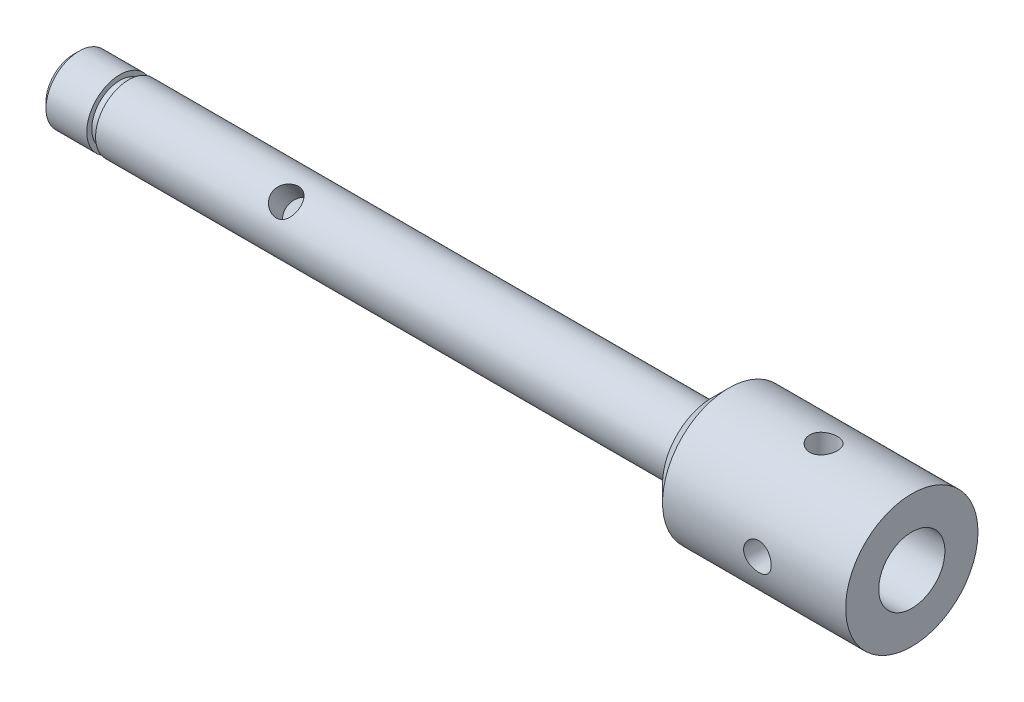
ISO-10303-21;
HEADER;
FILE_DESCRIPTION(('STEP AP214'),'2;1');
FILE_NAME('part.step','',(''),(''),'','','');
FILE_SCHEMA(('AUTOMOTIVE_DESIGN { 1 0 10303 214 1 1 1 1 }'));
ENDSEC;
DATA;
#1=APPLICATION_CONTEXT('core data for automotive mechanical design processes');
#2=APPLICATION_PROTOCOL_DEFINITION('international standard','automotive_design',2000,#1);
#3=PRODUCT_CONTEXT('',#1,'mechanical');
#4=PRODUCT('Part','Part','',(#3));
#5=PRODUCT_RELATED_PRODUCT_CATEGORY('part','',(#4));
#6=PRODUCT_DEFINITION_FORMATION('','',#4);
#7=PRODUCT_DEFINITION_CONTEXT('part definition',#1,'design');
#8=PRODUCT_DEFINITION('design','',#6,#7);
#9=PRODUCT_DEFINITION_SHAPE('','',#8);
#10=(LENGTH_UNIT() NAMED_UNIT(*) SI_UNIT(.MILLI.,.METRE.));
#11=(NAMED_UNIT(*) PLANE_ANGLE_UNIT() SI_UNIT($,.RADIAN.));
#12=(NAMED_UNIT(*) SI_UNIT($,.STERADIAN.) SOLID_ANGLE_UNIT());
#13=UNCERTAINTY_MEASURE_WITH_UNIT(LENGTH_MEASURE(1.E-05),#10,'distance_accuracy_value','');
#14=(GEOMETRIC_REPRESENTATION_CONTEXT(3) GLOBAL_UNCERTAINTY_ASSIGNED_CONTEXT((#13)) GLOBAL_UNIT_ASSIGNED_CONTEXT((#10,
#11,#12)) REPRESENTATION_CONTEXT('',''));
#15=CARTESIAN_POINT('',(0.,0.,0.));
#16=DIRECTION('',(0.,0.,1.));
#17=DIRECTION('',(1.,0.,0.));
#18=AXIS2_PLACEMENT_3D('',#15,#16,#17);
#19=CARTESIAN_POINT('',(27.2,0.,3.));
#20=DIRECTION('',(1.,0.,0.));
#21=DIRECTION('',(0.,0.,-1.));
#22=AXIS2_PLACEMENT_3D('',#19,#20,#21);
#23=PLANE('',#22);
#24=CARTESIAN_POINT('',(27.2,0.,0.));
#25=DIRECTION('',(1.,0.,0.));
#26=DIRECTION('',(0.,0.,-1.));
#27=AXIS2_PLACEMENT_3D('',#24,#25,#26);
#28=CIRCLE('',#27,4.5);
#29=CARTESIAN_POINT('',(27.2,0.,-4.5));
#30=VERTEX_POINT('',#29);
#31=EDGE_CURVE('E198',#30,#30,#28,.T.);
#32=ORIENTED_EDGE('',*,*,#31,.F.);
#33=EDGE_LOOP('',(#32));
#34=FACE_BOUND('',#33,.T.);
#35=CARTESIAN_POINT('',(27.2,0.,0.));
#36=DIRECTION('',(1.,0.,0.));
#37=DIRECTION('',(0.,0.,-1.));
#38=AXIS2_PLACEMENT_3D('',#35,#36,#37);
#39=CIRCLE('',#38,3.);
#40=CARTESIAN_POINT('',(27.2,0.,-3.));
#41=VERTEX_POINT('',#40);
#42=EDGE_CURVE('E177',#41,#41,#39,.T.);
#43=ORIENTED_EDGE('',*,*,#42,.T.);
#44=EDGE_LOOP('',(#43));
#45=FACE_BOUND('',#44,.T.);
#46=ADVANCED_FACE('F41',(#34,#45),#23,.F.);
#47=CARTESIAN_POINT('',(27.2,0.,0.));
#48=DIRECTION('',(1.,0.,0.));
#49=DIRECTION('',(0.,0.,-1.));
#50=AXIS2_PLACEMENT_3D('',#47,#48,#49);
#51=CONICAL_SURFACE('',#50,4.5,0.785398163397448);
#52=CARTESIAN_POINT('',(28.7,0.,0.));
#53=DIRECTION('',(1.,0.,0.));
#54=DIRECTION('',(0.,0.,-1.));
#55=AXIS2_PLACEMENT_3D('',#52,#53,#54);
#56=CIRCLE('',#55,6.);
#57=CARTESIAN_POINT('',(28.7,0.,-6.));
#58=VERTEX_POINT('',#57);
#59=EDGE_CURVE('E195',#58,#58,#56,.T.);
#60=ORIENTED_EDGE('',*,*,#59,.F.);
#61=EDGE_LOOP('',(#60));
#62=FACE_BOUND('',#61,.T.);
#63=ORIENTED_EDGE('',*,*,#31,.T.);
#64=EDGE_LOOP('',(#63));
#65=FACE_BOUND('',#64,.T.);
#66=ADVANCED_FACE('F125',(#62,#65),#51,.T.);
#67=CARTESIAN_POINT('',(30.7,0.,0.));
#68=DIRECTION('',(1.,0.,0.));
#69=DIRECTION('',(0.,0.,-1.));
#70=AXIS2_PLACEMENT_3D('',#67,#68,#69);
#71=CYLINDRICAL_SURFACE('',#70,6.);
#72=CARTESIAN_POINT('',(36.05,0.,6.));
#73=CARTESIAN_POINT('',(36.0500024774692,0.0694090417016604,5.99999871526651));
#74=CARTESIAN_POINT('',(36.0558006657187,0.138848789520875,5.99878328775043));
#75=CARTESIAN_POINT('',(36.0788193495328,0.275761316266992,5.9940520099068));
#76=CARTESIAN_POINT('',(36.0960485230369,0.34323256012831,5.99053441189248));
#77=CARTESIAN_POINT('',(36.1413704549218,0.474209132291339,5.98159109196202));
#78=CARTESIAN_POINT('',(36.1694523959989,0.537718336709182,5.97616727052645));
#79=CARTESIAN_POINT('',(36.2356496088562,0.659120328605955,5.96399927809859));
#80=CARTESIAN_POINT('',(36.2737644311558,0.717013367534324,5.95725516625975));
#81=CARTESIAN_POINT('',(36.3595363401906,0.826390324308832,5.9430770002465));
#82=CARTESIAN_POINT('',(36.4073120012351,0.877780244162678,5.93563505848532));
#83=CARTESIAN_POINT('',(36.5107946591951,0.971877776769385,5.92095657692448));
#84=CARTESIAN_POINT('',(36.5665023118723,1.01458467096098,5.91372005416683));
#85=CARTESIAN_POINT('',(36.6849519687661,1.09051031677216,5.90019442595308));
#86=CARTESIAN_POINT('',(36.7477583845027,1.1236305468065,5.89391545174828));
#87=CARTESIAN_POINT('',(36.8781974517727,1.17881119348063,5.8831284065002));
#88=CARTESIAN_POINT('',(36.9458295824425,1.20087280167641,5.87862014467568));
#89=CARTESIAN_POINT('',(37.0829852374156,1.23300240133736,5.87196500986123));
#90=CARTESIAN_POINT('',(37.1524683593348,1.24323597696798,5.86978556855865));
#91=CARTESIAN_POINT('',(37.2921968428626,1.25193357655614,5.86793690716491));
#92=CARTESIAN_POINT('',(37.3624421188653,1.25039890894686,5.86826740800981));
#93=CARTESIAN_POINT('',(37.5004810279752,1.23573719037197,5.87137174319175));
#94=CARTESIAN_POINT('',(37.5682959796612,1.2228010523272,5.87410533679901));
#95=CARTESIAN_POINT('',(37.7007715096449,1.18600543529945,5.88164437615942));
#96=CARTESIAN_POINT('',(37.7654319256063,1.16214539481381,5.88644992841317));
#97=CARTESIAN_POINT('',(37.890307228416,1.10400003213928,5.89763191464102));
#98=CARTESIAN_POINT('',(37.9504862965271,1.06964002534237,5.90401953785586));
#99=CARTESIAN_POINT('',(38.0642957442682,0.991522699274813,5.91763890010721));
#100=CARTESIAN_POINT('',(38.117925308836,0.94776421226258,5.92487074398537));
#101=CARTESIAN_POINT('',(38.2182139610804,0.851074921546775,5.93953730929909));
#102=CARTESIAN_POINT('',(38.264716168897,0.797981433412077,5.94697323199473));
#103=CARTESIAN_POINT('',(38.348180442229,0.684667288611796,5.96108088143001));
#104=CARTESIAN_POINT('',(38.3851423645984,0.624446525025764,5.96775259670236));
#105=CARTESIAN_POINT('',(38.4485100815359,0.498405541235478,5.97959870942815));
#106=CARTESIAN_POINT('',(38.4748968045671,0.432575461926501,5.98477039710258));
#107=CARTESIAN_POINT('',(38.5161917048355,0.297284620972158,5.99301338211281));
#108=CARTESIAN_POINT('',(38.5311013932314,0.227824338595092,5.99608495596053));
#109=CARTESIAN_POINT('',(38.5487942520679,0.0885918657008374,5.99974275215456));
#110=CARTESIAN_POINT('',(38.5517919414942,0.0188480555261806,6.00037293537579));
#111=CARTESIAN_POINT('',(38.5461550500309,-0.120143798757713,5.99919952252774));
#112=CARTESIAN_POINT('',(38.5375211813984,-0.189391872962257,5.99739607548153));
#113=CARTESIAN_POINT('',(38.5090443465305,-0.324726367119813,5.99158564979184));
#114=CARTESIAN_POINT('',(38.4893125146165,-0.390837192894206,5.98760052868077));
#115=CARTESIAN_POINT('',(38.4393221395786,-0.51881144666133,5.97787227242395));
#116=CARTESIAN_POINT('',(38.409062759134,-0.580674536336773,5.97212899744579));
#117=CARTESIAN_POINT('',(38.3384196217624,-0.69929430694349,5.95941241490714));
#118=CARTESIAN_POINT('',(38.2979080704309,-0.75597321946983,5.9524239381233));
#119=CARTESIAN_POINT('',(38.2080804369237,-0.861805445886515,5.93802568299709));
#120=CARTESIAN_POINT('',(38.1587633244811,-0.910957877913281,5.93061585542511));
#121=CARTESIAN_POINT('',(38.0517444230003,-1.0011786486518,5.91606024531377));
#122=CARTESIAN_POINT('',(37.9939169680447,-1.04209914600204,5.90892089307501));
#123=CARTESIAN_POINT('',(37.8720837157862,-1.11364719079243,5.89585601015805));
#124=CARTESIAN_POINT('',(37.8080781758609,-1.14427516677864,5.88993042894651));
#125=CARTESIAN_POINT('',(37.6760388037018,-1.19417246443922,5.88001700708041));
#126=CARTESIAN_POINT('',(37.6080289628342,-1.21350309828031,5.87601872784687));
#127=CARTESIAN_POINT('',(37.4696334495077,-1.24044038523407,5.87039184709697));
#128=CARTESIAN_POINT('',(37.3992481183805,-1.2480487154444,5.86876290660367));
#129=CARTESIAN_POINT('',(37.2595865990004,-1.25125926487611,5.86807907308506));
#130=CARTESIAN_POINT('',(37.190315929778,-1.24709542622725,5.86897402321502));
#131=CARTESIAN_POINT('',(37.0534859910798,-1.22739905314031,5.87312447254928));
#132=CARTESIAN_POINT('',(36.9859267051839,-1.21186662782266,5.87637994909626));
#133=CARTESIAN_POINT('',(36.8546022281093,-1.16998217768584,5.88486132447716));
#134=CARTESIAN_POINT('',(36.7908267535131,-1.14366117568421,5.8900815700793));
#135=CARTESIAN_POINT('',(36.6685612239733,-1.08097457299757,5.90190705738738));
#136=CARTESIAN_POINT('',(36.6100716603669,-1.04460803983029,5.9085124276546));
#137=CARTESIAN_POINT('',(36.4988783729205,-0.962073695342404,5.92251579551146));
#138=CARTESIAN_POINT('',(36.446300875435,-0.915737890418218,5.92992613868404));
#139=CARTESIAN_POINT('',(36.3495905067736,-0.814924438115327,5.94461839583213));
#140=CARTESIAN_POINT('',(36.3054595824485,-0.760444918832962,5.9519002798488));
#141=CARTESIAN_POINT('',(36.2264114268159,-0.644134427507699,5.96561444547638));
#142=CARTESIAN_POINT('',(36.1916063201137,-0.582225921521344,5.97203596073244));
#143=CARTESIAN_POINT('',(36.13294977157,-0.453319843998451,5.98319908494092));
#144=CARTESIAN_POINT('',(36.1090887528181,-0.386326781907241,5.98794216182101));
#145=CARTESIAN_POINT('',(36.0774597217116,-0.266015292900103,5.99432499781444));
#146=CARTESIAN_POINT('',(36.0671812367911,-0.213367593727927,5.99644035661395));
#147=CARTESIAN_POINT('',(36.0534505457227,-0.107152674176536,5.99927832789758));
#148=CARTESIAN_POINT('',(36.0499980873328,-0.0535854878488714,6.00000099184586));
#149=CARTESIAN_POINT('',(36.05,0.,6.));
#150=B_SPLINE_CURVE_WITH_KNOTS('',3,(#72,#73,#74,#75,#76,#77,#78,#79,#80,#81,#82,#83,#84,#85,
#86,#87,#88,#89,#90,#91,#92,#93,#94,#95,#96,#97,#98,#99,#100,#101,#102,#103,#104,#105,#106,#107,
#108,#109,#110,#111,#112,#113,#114,#115,#116,#117,#118,#119,#120,#121,#122,#123,#124,#125,#126,
#127,#128,#129,#130,#131,#132,#133,#134,#135,#136,#137,#138,#139,#140,#141,#142,#143,#144,#145,
#146,#147,#148,#149),.UNSPECIFIED.,.T.,.F.,(4,2,2,2,2,2,2,2,2,2,2,2,2,2,2,2,2,2,2,2,2,2,2,2,2,2,
2,2,2,2,2,2,2,2,2,2,2,2,4),(0.,0.208031045103183,0.416220199906223,0.624202378825437,
0.832175241572985,1.04287526388122,1.25359271551785,1.46640449178547,1.67919333285489,
1.88896575169853,2.09871484767164,2.30501712129058,2.51133000030278,2.71914592416748,
2.92698768368034,3.13889526355465,3.35080602278216,3.56309724499661,3.77536051045769,
3.98378339407674,4.19219351552276,4.3985528663262,4.60492863390931,4.81401583995734,
5.02312752564572,5.23571263829335,5.44828889851307,5.65970050095023,5.87108185414182,
6.07829223291035,6.28550062281359,6.49211731393253,6.69875319081478,6.90919024830307,
7.11967575117367,7.33258864398254,7.54531486464971,7.70592588477277,7.86653096973388),.UNSPECIFIED.);
#151=CARTESIAN_POINT('',(36.05,0.,6.));
#152=VERTEX_POINT('',#151);
#153=EDGE_CURVE('E87',#152,#152,#150,.T.);
#154=ORIENTED_EDGE('',*,*,#153,.T.);
#155=EDGE_LOOP('',(#154));
#156=FACE_BOUND('',#155,.T.);
#157=CARTESIAN_POINT('',(37.3,5.86834729715275,1.24999999999999));
#158=CARTESIAN_POINT('',(37.230609384849,5.86834869213646,1.24999750877598));
#159=CARTESIAN_POINT('',(37.1611880279848,5.86959145924544,1.24420229433947));
#160=CARTESIAN_POINT('',(37.0243136826827,5.87442015581798,1.22119649233778));
#161=CARTESIAN_POINT('',(36.9568622444936,5.87800788138388,1.20397715440341));
#162=CARTESIAN_POINT('',(36.8259276271651,5.88710292961931,1.15868397507229));
#163=CARTESIAN_POINT('',(36.7624404040082,5.89260825706946,1.13062141248931));
#164=CARTESIAN_POINT('',(36.6410755003544,5.90491581335742,1.06446988601731));
#165=CARTESIAN_POINT('',(36.58319759327,5.91171798977623,1.02638132735818));
#166=CARTESIAN_POINT('',(36.4738046248465,5.92596934661468,0.940636399466071));
#167=CARTESIAN_POINT('',(36.4223881063735,5.93342614373039,0.892855554869657));
#168=CARTESIAN_POINT('',(36.3282389313519,5.94807966802576,0.789351223880625));
#169=CARTESIAN_POINT('',(36.2855069117086,5.95527637609915,0.733627155455992));
#170=CARTESIAN_POINT('',(36.2095541119171,5.96868135118849,0.615162052999578));
#171=CARTESIAN_POINT('',(36.1764274735367,5.97487958631243,0.552359428204931));
#172=CARTESIAN_POINT('',(36.1212339471402,5.98550347343303,0.42192855100671));
#173=CARTESIAN_POINT('',(36.0991659348465,5.98992930561223,0.354300789950583));
#174=CARTESIAN_POINT('',(36.0670242388825,5.99645589892179,0.217162904200495));
#175=CARTESIAN_POINT('',(36.0567839828048,5.99858891959926,0.147693380916351));
#176=CARTESIAN_POINT('',(36.048068304243,6.00040112580612,0.00799184883951788));
#177=CARTESIAN_POINT('',(36.0495916558069,6.0000805670369,-0.0622400797368444));
#178=CARTESIAN_POINT('',(36.0642346009567,5.99704658090511,-0.200326586199577));
#179=CARTESIAN_POINT('',(36.0771747189581,5.99437018956584,-0.268201128726479));
#180=CARTESIAN_POINT('',(36.1139986253313,5.98696720898885,-0.400793746289756));
#181=CARTESIAN_POINT('',(36.1378828772031,5.98224053291904,-0.465511687511025));
#182=CARTESIAN_POINT('',(36.1960800521255,5.97120767323924,-0.590460005384686));
#183=CARTESIAN_POINT('',(36.2304622942097,5.96489104125346,-0.650657134981651));
#184=CARTESIAN_POINT('',(36.3086280028404,5.95137300440189,-0.764493456510647));
#185=CARTESIAN_POINT('',(36.3524126382061,5.94417148958325,-0.818131831816417));
#186=CARTESIAN_POINT('',(36.4491216248911,5.92951700233276,-0.91839420327691));
#187=CARTESIAN_POINT('',(36.5022030599819,5.92206184975926,-0.964866487494793));
#188=CARTESIAN_POINT('',(36.6154820489948,5.90786872648996,-1.04827597240488));
#189=CARTESIAN_POINT('',(36.6756797613872,5.9011307717716,-1.0852129606998));
#190=CARTESIAN_POINT('',(36.8017122548288,5.88912998409156,-1.14856217138454));
#191=CARTESIAN_POINT('',(36.8675606506934,5.88387085232125,-1.17494805489727));
#192=CARTESIAN_POINT('',(37.0028916193694,5.8754760641036,-1.21623577538672));
#193=CARTESIAN_POINT('',(37.0723736728081,5.87234010507182,-1.23113924882348));
#194=CARTESIAN_POINT('',(37.2116197063189,5.86860783239132,-1.24880863867017));
#195=CARTESIAN_POINT('',(37.281354584537,5.86796551863474,-1.25179442917998));
#196=CARTESIAN_POINT('',(37.4203258115401,5.86916952018704,-1.24613693439294));
#197=CARTESIAN_POINT('',(37.4895621909023,5.87101568152624,-1.23749436857862));
#198=CARTESIAN_POINT('',(37.6248205160581,5.87694538226167,-1.20901558325483));
#199=CARTESIAN_POINT('',(37.6908686671788,5.88100511282998,-1.18929841376871));
#200=CARTESIAN_POINT('',(37.8187239894416,5.8908833850312,-1.13935810860918));
#201=CARTESIAN_POINT('',(37.8805307856504,5.89670208191057,-1.10913404556146));
#202=CARTESIAN_POINT('',(37.9991064412162,5.90954501937191,-1.03854598181484));
#203=CARTESIAN_POINT('',(38.0557922044662,5.91658506648324,-0.998045327353955));
#204=CARTESIAN_POINT('',(38.1616432491551,5.93103483993908,-0.908234440569873));
#205=CARTESIAN_POINT('',(38.2108076862392,5.93844460766532,-0.858923220505168));
#206=CARTESIAN_POINT('',(38.3010627130972,5.95294924316737,-0.751900450843335));
#207=CARTESIAN_POINT('',(38.3420040950264,5.9600367471991,-0.694061907614547));
#208=CARTESIAN_POINT('',(38.413588752088,5.97296708772407,-0.572200102216356));
#209=CARTESIAN_POINT('',(38.4442324822374,5.97880997920818,-0.508177113476878));
#210=CARTESIAN_POINT('',(38.4941386793173,5.98856148270679,-0.376142117847916));
#211=CARTESIAN_POINT('',(38.5134691655443,5.99248163136497,-0.308156710970192));
#212=CARTESIAN_POINT('',(38.5404144040081,5.99799561410226,-0.16981340050347));
#213=CARTESIAN_POINT('',(38.5480306935327,5.99958975342889,-0.0994558094616936));
#214=CARTESIAN_POINT('',(38.5512676220485,6.00026408056941,0.0402133434703402));
#215=CARTESIAN_POINT('',(38.5471118999947,5.99939113754811,0.109519592177923));
#216=CARTESIAN_POINT('',(38.5274193613471,5.99532874094472,0.246422870373552));
#217=CARTESIAN_POINT('',(38.5118827135932,5.99213932172839,0.314019925202701));
#218=CARTESIAN_POINT('',(38.4699722053514,5.98380460077544,0.44543196549205));
#219=CARTESIAN_POINT('',(38.4436273361469,5.97866453407556,0.509256550004522));
#220=CARTESIAN_POINT('',(38.380877602268,5.96697995347704,0.631610567220739));
#221=CARTESIAN_POINT('',(38.3444718616568,5.96043531730246,0.690139538279507));
#222=CARTESIAN_POINT('',(38.2618903320067,5.94651596786387,0.801340321298254));
#223=CARTESIAN_POINT('',(38.2155557119433,5.93912880302851,0.853892633615918));
#224=CARTESIAN_POINT('',(38.1147554990029,5.9244278681135,0.950552741980376));
#225=CARTESIAN_POINT('',(38.0602879700516,5.91711411595368,0.994658521571224));
#226=CARTESIAN_POINT('',(37.9439908975666,5.90329191643327,1.07367451852766));
#227=CARTESIAN_POINT('',(37.8820815885379,5.89679406702551,1.10846928126993));
#228=CARTESIAN_POINT('',(37.7531748439167,5.88547039658063,1.16710627925305));
#229=CARTESIAN_POINT('',(37.686181951547,5.88064310352601,1.19095816292459));
#230=CARTESIAN_POINT('',(37.5658937184316,5.87414004405196,1.2225655413186));
#231=CARTESIAN_POINT('',(37.5132704634069,5.87198163591589,1.23283449005669));
#232=CARTESIAN_POINT('',(37.407104219479,5.86908475266778,1.24655254358403));
#233=CARTESIAN_POINT('',(37.3535612676899,5.86834622039194,1.2500019229274));
#234=CARTESIAN_POINT('',(37.3,5.86834729715275,1.24999999999999));
#235=B_SPLINE_CURVE_WITH_KNOTS('',3,(#157,#158,#159,#160,#161,#162,#163,#164,#165,#166,#167,
#168,#169,#170,#171,#172,#173,#174,#175,#176,#177,#178,#179,#180,#181,#182,#183,#184,#185,#186,
#187,#188,#189,#190,#191,#192,#193,#194,#195,#196,#197,#198,#199,#200,#201,#202,#203,#204,#205,
#206,#207,#208,#209,#210,#211,#212,#213,#214,#215,#216,#217,#218,#219,#220,#221,#222,#223,#224,
#225,#226,#227,#228,#229,#230,#231,#232,#233,#234),.UNSPECIFIED.,.T.,.F.,(4,2,2,2,2,2,2,2,2,2,2,
2,2,2,2,2,2,2,2,2,2,2,2,2,2,2,2,2,2,2,2,2,2,2,2,2,2,2,4),(0.,0.207975654071263,0.41611079241747,
0.624030014802732,0.831940834815789,1.04271333467885,1.25350128663873,1.46629026266843,
1.67905760106932,1.88879048859263,2.09850151896338,2.3049734141646,2.51145405455869,
2.71932871977948,2.92722924104258,3.13905862244911,3.35089272191626,3.56325237332486,
3.77558175387594,3.98397516009789,4.19235567296522,4.3985378623192,4.60473825464028,
4.81383917934648,5.02296356082183,5.2355945875334,5.44821621759037,5.65954599648531,
5.87084803959578,6.07816293922641,6.28547476332978,6.49223410585097,6.6990114552817,
6.90938318978569,7.1198050842753,7.33272651358118,7.54545984571983,7.70599867585765,
7.86653104261156),.UNSPECIFIED.);
#236=CARTESIAN_POINT('',(37.3,5.86834729715275,1.24999999999999));
#237=VERTEX_POINT('',#236);
#238=EDGE_CURVE('E55',#237,#237,#235,.T.);
#239=ORIENTED_EDGE('',*,*,#238,.T.);
#240=EDGE_LOOP('',(#239));
#241=FACE_BOUND('',#240,.T.);
#242=CARTESIAN_POINT('',(45.3,0.,0.));
#243=DIRECTION('',(1.,0.,0.));
#244=DIRECTION('',(0.,0.,-1.));
#245=AXIS2_PLACEMENT_3D('',#242,#243,#244);
#246=CIRCLE('',#245,6.);
#247=CARTESIAN_POINT('',(45.3,0.,-6.));
#248=VERTEX_POINT('',#247);
#249=EDGE_CURVE('E192',#248,#248,#246,.T.);
#250=ORIENTED_EDGE('',*,*,#249,.F.);
#251=EDGE_LOOP('',(#250));
#252=FACE_BOUND('',#251,.T.);
#253=ORIENTED_EDGE('',*,*,#59,.T.);
#254=EDGE_LOOP('',(#253));
#255=FACE_BOUND('',#254,.T.);
#256=ADVANCED_FACE('F130',(#156,#241,#252,#255),#71,.T.);
#257=CARTESIAN_POINT('',(45.3,0.,3.));
#258=DIRECTION('',(-1.,0.,0.));
#259=DIRECTION('',(0.,0.,1.));
#260=AXIS2_PLACEMENT_3D('',#257,#258,#259);
#261=PLANE('',#260);
#262=CARTESIAN_POINT('',(45.3,0.,0.));
#263=DIRECTION('',(1.,0.,0.));
#264=DIRECTION('',(0.,0.,-1.));
#265=AXIS2_PLACEMENT_3D('',#262,#263,#264);
#266=CIRCLE('',#265,3.);
#267=CARTESIAN_POINT('',(45.3,0.,-3.));
#268=VERTEX_POINT('',#267);
#269=EDGE_CURVE('E70',#268,#268,#266,.T.);
#270=ORIENTED_EDGE('',*,*,#269,.F.);
#271=EDGE_LOOP('',(#270));
#272=FACE_BOUND('',#271,.T.);
#273=ORIENTED_EDGE('',*,*,#249,.T.);
#274=EDGE_LOOP('',(#273));
#275=FACE_BOUND('',#274,.T.);
#276=ADVANCED_FACE('F138',(#272,#275),#261,.F.);
#277=CARTESIAN_POINT('',(-30.7,0.,3.));
#278=DIRECTION('',(1.,0.,0.));
#279=DIRECTION('',(0.,0.,-1.));
#280=AXIS2_PLACEMENT_3D('',#277,#278,#279);
#281=PLANE('',#280);
#282=CARTESIAN_POINT('',(-30.7,0.,0.));
#283=DIRECTION('',(1.,0.,0.));
#284=DIRECTION('',(0.,0.,-1.));
#285=AXIS2_PLACEMENT_3D('',#282,#283,#284);
#286=CIRCLE('',#285,2.49999999999998);
#287=CARTESIAN_POINT('',(-30.7,0.,-2.49999999999998));
#288=VERTEX_POINT('',#287);
#289=EDGE_CURVE('E203',#288,#288,#286,.F.);
#290=ORIENTED_EDGE('',*,*,#289,.T.);
#291=EDGE_LOOP('',(#290));
#292=FACE_BOUND('',#291,.T.);
#293=ADVANCED_FACE('F142',(#292),#281,.F.);
#294=CARTESIAN_POINT('',(30.7,0.,0.));
#295=DIRECTION('',(1.,0.,0.));
#296=DIRECTION('',(0.,0.,-1.));
#297=AXIS2_PLACEMENT_3D('',#294,#295,#296);
#298=CYLINDRICAL_SURFACE('',#297,3.);
#299=CARTESIAN_POINT('',(-30.2,0.,0.));
#300=DIRECTION('',(1.,0.,0.));
#301=DIRECTION('',(0.,0.,-1.));
#302=AXIS2_PLACEMENT_3D('',#299,#300,#301);
#303=CIRCLE('',#302,3.);
#304=CARTESIAN_POINT('',(-30.2,0.,-3.));
#305=VERTEX_POINT('',#304);
#306=EDGE_CURVE('E201',#305,#305,#303,.T.);
#307=ORIENTED_EDGE('',*,*,#306,.T.);
#308=EDGE_LOOP('',(#307));
#309=FACE_BOUND('',#308,.T.);
#310=CARTESIAN_POINT('',(-26.5,0.,0.));
#311=DIRECTION('',(1.,0.,0.));
#312=DIRECTION('',(0.,0.,-1.));
#313=AXIS2_PLACEMENT_3D('',#310,#311,#312);
#314=CIRCLE('',#313,3.);
#315=CARTESIAN_POINT('',(-26.5,0.,-3.));
#316=VERTEX_POINT('',#315);
#317=EDGE_CURVE('E189',#316,#316,#314,.T.);
#318=ORIENTED_EDGE('',*,*,#317,.F.);
#319=EDGE_LOOP('',(#318));
#320=FACE_BOUND('',#319,.T.);
#321=ADVANCED_FACE('F146',(#309,#320),#298,.T.);
#322=CARTESIAN_POINT('',(-26.5,0.,2.54999999999999));
#323=DIRECTION('',(-1.,0.,0.));
#324=DIRECTION('',(0.,0.,1.));
#325=AXIS2_PLACEMENT_3D('',#322,#323,#324);
#326=PLANE('',#325);
#327=CARTESIAN_POINT('',(-26.5,0.,0.));
#328=DIRECTION('',(1.,0.,0.));
#329=DIRECTION('',(0.,0.,-1.));
#330=AXIS2_PLACEMENT_3D('',#327,#328,#329);
#331=CIRCLE('',#330,2.54999999999999);
#332=CARTESIAN_POINT('',(-26.5,0.,-2.54999999999999));
#333=VERTEX_POINT('',#332);
#334=EDGE_CURVE('E184',#333,#333,#331,.T.);
#335=ORIENTED_EDGE('',*,*,#334,.F.);
#336=EDGE_LOOP('',(#335));
#337=FACE_BOUND('',#336,.T.);
#338=ORIENTED_EDGE('',*,*,#317,.T.);
#339=EDGE_LOOP('',(#338));
#340=FACE_BOUND('',#339,.T.);
#341=ADVANCED_FACE('F150',(#337,#340),#326,.F.);
#342=CARTESIAN_POINT('',(30.7,0.,0.));
#343=DIRECTION('',(1.,0.,0.));
#344=DIRECTION('',(0.,0.,-1.));
#345=AXIS2_PLACEMENT_3D('',#342,#343,#344);
#346=CYLINDRICAL_SURFACE('',#345,2.54999999999999);
#347=CARTESIAN_POINT('',(-25.7,0.,0.));
#348=DIRECTION('',(1.,0.,0.));
#349=DIRECTION('',(0.,0.,-1.));
#350=AXIS2_PLACEMENT_3D('',#347,#348,#349);
#351=CIRCLE('',#350,2.54999999999999);
#352=CARTESIAN_POINT('',(-25.7,0.,-2.54999999999999));
#353=VERTEX_POINT('',#352);
#354=EDGE_CURVE('E181',#353,#353,#351,.T.);
#355=ORIENTED_EDGE('',*,*,#354,.F.);
#356=EDGE_LOOP('',(#355));
#357=FACE_BOUND('',#356,.T.);
#358=ORIENTED_EDGE('',*,*,#334,.T.);
#359=EDGE_LOOP('',(#358));
#360=FACE_BOUND('',#359,.T.);
#361=ADVANCED_FACE('F154',(#357,#360),#346,.T.);
#362=CARTESIAN_POINT('',(-25.7,0.,3.));
#363=DIRECTION('',(1.,0.,0.));
#364=DIRECTION('',(0.,0.,-1.));
#365=AXIS2_PLACEMENT_3D('',#362,#363,#364);
#366=PLANE('',#365);
#367=CARTESIAN_POINT('',(-25.7,0.,0.));
#368=DIRECTION('',(1.,0.,0.));
#369=DIRECTION('',(0.,0.,-1.));
#370=AXIS2_PLACEMENT_3D('',#367,#368,#369);
#371=CIRCLE('',#370,3.);
#372=CARTESIAN_POINT('',(-25.7,0.,-3.));
#373=VERTEX_POINT('',#372);
#374=EDGE_CURVE('E180',#373,#373,#371,.T.);
#375=ORIENTED_EDGE('',*,*,#374,.F.);
#376=EDGE_LOOP('',(#375));
#377=FACE_BOUND('',#376,.T.);
#378=ORIENTED_EDGE('',*,*,#354,.T.);
#379=EDGE_LOOP('',(#378));
#380=FACE_BOUND('',#379,.T.);
#381=ADVANCED_FACE('F158',(#377,#380),#366,.F.);
#382=CARTESIAN_POINT('',(30.7,0.,0.));
#383=DIRECTION('',(1.,0.,0.));
#384=DIRECTION('',(0.,0.,-1.));
#385=AXIS2_PLACEMENT_3D('',#382,#383,#384);
#386=CYLINDRICAL_SURFACE('',#385,3.);
#387=CARTESIAN_POINT('',(-9.69999999999999,1.45725163441085,2.62229244631618));
#388=CARTESIAN_POINT('',(-9.76667189089685,1.45726179732362,2.62229072035417));
#389=CARTESIAN_POINT('',(-9.83345265682621,1.46242939631793,2.61943604998584));
#390=CARTESIAN_POINT('',(-9.96508694205714,1.48272432827545,2.60799826208618));
#391=CARTESIAN_POINT('',(-10.0299347266752,1.49787870698695,2.59939958803531));
#392=CARTESIAN_POINT('',(-10.1555611296911,1.53694402846531,2.57649173670678));
#393=CARTESIAN_POINT('',(-10.216355163715,1.56081926066065,2.56220582665124));
#394=CARTESIAN_POINT('',(-10.332759449578,1.61583000686717,2.52787270306059));
#395=CARTESIAN_POINT('',(-10.3883709234331,1.64696380325954,2.50782685225945));
#396=CARTESIAN_POINT('',(-10.4963257249735,1.71681425383968,2.46057350785954));
#397=CARTESIAN_POINT('',(-10.5483075587441,1.75585966211184,2.43302572268617));
#398=CARTESIAN_POINT('',(-10.6442002224975,1.83839325759243,2.37127921641488));
#399=CARTESIAN_POINT('',(-10.688107940613,1.88188314775642,2.33707794138432));
#400=CARTESIAN_POINT('',(-10.7684495308793,1.97336905117507,2.2604253378426));
#401=CARTESIAN_POINT('',(-10.8044766280323,2.0214786953555,2.21768051420216));
#402=CARTESIAN_POINT('',(-10.8652760205056,2.11829251863121,2.12539377774707));
#403=CARTESIAN_POINT('',(-10.8900533119642,2.16699642392196,2.07585489498695));
#404=CARTESIAN_POINT('',(-10.9263394587567,2.26033348536551,1.97368378940636));
#405=CARTESIAN_POINT('',(-10.938471694902,2.30504658597604,1.92134669736412));
#406=CARTESIAN_POINT('',(-10.9511376411598,2.39132714775115,1.81282975254559));
#407=CARTESIAN_POINT('',(-10.951676055883,2.43289587803344,1.75665146775554));
#408=CARTESIAN_POINT('',(-10.9414657190667,2.50912152525229,1.64577132233137));
#409=CARTESIAN_POINT('',(-10.9314018994743,2.54404512531086,1.59118768236724));
#410=CARTESIAN_POINT('',(-10.9014468973618,2.60920185851382,1.48192889927436));
#411=CARTESIAN_POINT('',(-10.8815549903698,2.63943464566163,1.42725374969618));
#412=CARTESIAN_POINT('',(-10.8322719591054,2.69534195753457,1.3186813478563));
#413=CARTESIAN_POINT('',(-10.8027405371292,2.72093990030251,1.26480869062801));
#414=CARTESIAN_POINT('',(-10.7351542432997,2.76710037597535,1.16035396981371));
#415=CARTESIAN_POINT('',(-10.697096359155,2.78766112391544,1.1097730773364));
#416=CARTESIAN_POINT('',(-10.6104175795954,2.82539032249079,1.01005397939162));
#417=CARTESIAN_POINT('',(-10.561241208721,2.84221749629643,0.96126878465629));
#418=CARTESIAN_POINT('',(-10.4552885592934,2.87114767708475,0.871068084242581));
#419=CARTESIAN_POINT('',(-10.3985093617079,2.88324886254533,0.829655423475404));
#420=CARTESIAN_POINT('',(-10.2766049633381,2.90375383075197,0.754832407587505));
#421=CARTESIAN_POINT('',(-10.2112667942567,2.91202302330776,0.721729789043686));
#422=CARTESIAN_POINT('',(-10.0755189550255,2.92496933660976,0.667341912857268));
#423=CARTESIAN_POINT('',(-10.0051129517304,2.92964902654014,0.646048206023237));
#424=CARTESIAN_POINT('',(-9.86610319108599,2.93574126800468,0.61775453829243));
#425=CARTESIAN_POINT('',(-9.79767887774094,2.9373460947829,0.60991682426925));
#426=CARTESIAN_POINT('',(-9.66052151758849,2.93805823255438,0.606481132240161));
#427=CARTESIAN_POINT('',(-9.59178858580828,2.9371664075936,0.610878919745442));
#428=CARTESIAN_POINT('',(-9.46060161456955,2.93292479530176,0.630906375529169));
#429=CARTESIAN_POINT('',(-9.39802731321319,2.92973602877029,0.645798922790256));
#430=CARTESIAN_POINT('',(-9.27614870350212,2.92079159681015,0.685112984692685));
#431=CARTESIAN_POINT('',(-9.21684516316928,2.9150353313549,0.709536726614914));
#432=CARTESIAN_POINT('',(-9.10038468964352,2.90021795197029,0.767903787274199));
#433=CARTESIAN_POINT('',(-9.04342502538967,2.8910272025277,0.80220645336879));
#434=CARTESIAN_POINT('',(-8.93559194750097,2.86881677078566,0.878328402415585));
#435=CARTESIAN_POINT('',(-8.88472118329813,2.85579543016024,0.920150937787844));
#436=CARTESIAN_POINT('',(-8.78619986511599,2.82410065815671,1.01344534174048));
#437=CARTESIAN_POINT('',(-8.73914860004933,2.80505339594761,1.06542557534014));
#438=CARTESIAN_POINT('',(-8.65452770802067,2.76118183980697,1.17444613968791));
#439=CARTESIAN_POINT('',(-8.61695877593629,2.73635712275211,1.23148684085992));
#440=CARTESIAN_POINT('',(-8.55241012455642,2.68051781346865,1.34871972541417));
#441=CARTESIAN_POINT('',(-8.52545775871051,2.64948753849579,1.40891960246476));
#442=CARTESIAN_POINT('',(-8.48338320766556,2.58142622042511,1.53004981931957));
#443=CARTESIAN_POINT('',(-8.46825398177393,2.54439876454082,1.59097970241947));
#444=CARTESIAN_POINT('',(-8.45114187447969,2.46789942893283,1.707033560141));
#445=CARTESIAN_POINT('',(-8.44831400030303,2.42877932048442,1.76226566747336));
#446=CARTESIAN_POINT('',(-8.45361314129394,2.34715284711974,1.86960326345898));
#447=CARTESIAN_POINT('',(-8.46173823601286,2.30464707706092,1.92170929855189));
#448=CARTESIAN_POINT('',(-8.48810607215866,2.2192867208128,2.01961383053855));
#449=CARTESIAN_POINT('',(-8.50597968046955,2.17649799643237,2.06557050935804));
#450=CARTESIAN_POINT('',(-8.55093424720912,2.09064122167797,2.15242935964222));
#451=CARTESIAN_POINT('',(-8.5780169546649,2.04757311976885,2.19333056893944));
#452=CARTESIAN_POINT('',(-8.64198952921446,1.96075993378061,2.27133884317379));
#453=CARTESIAN_POINT('',(-8.67926730142399,1.91707221922753,2.30819089827737));
#454=CARTESIAN_POINT('',(-8.76200718287189,1.83275576792571,2.37569531626767));
#455=CARTESIAN_POINT('',(-8.80747233040674,1.79212817473855,2.40634536862285));
#456=CARTESIAN_POINT('',(-8.9089448258544,1.7130280878751,2.46334558995301));
#457=CARTESIAN_POINT('',(-8.96545901462112,1.67489035926423,2.48926124818969));
#458=CARTESIAN_POINT('',(-9.08545874068019,1.60612577933059,2.53417712819009));
#459=CARTESIAN_POINT('',(-9.14894814805814,1.57550312840404,2.55317348541363));
#460=CARTESIAN_POINT('',(-9.28094383502274,1.52398717987208,2.58425386708882));
#461=CARTESIAN_POINT('',(-9.3494211587932,1.50304221470478,2.59637467991106));
#462=CARTESIAN_POINT('',(-9.48953957385066,1.47241331267062,2.6138714091583));
#463=CARTESIAN_POINT('',(-9.5611692072743,1.46269160795414,2.61926995181786));
#464=CARTESIAN_POINT('',(-9.65535852426188,1.45782319400708,2.62197366681803));
#465=CARTESIAN_POINT('',(-9.67767315738803,1.45724823109123,2.62229302430012));
#466=CARTESIAN_POINT('',(-9.69999999999999,1.45725163441085,2.62229244631618));
#467=B_SPLINE_CURVE_WITH_KNOTS('',3,(#387,#388,#389,#390,#391,#392,#393,#394,#395,#396,#397,
#398,#399,#400,#401,#402,#403,#404,#405,#406,#407,#408,#409,#410,#411,#412,#413,#414,#415,#416,
#417,#418,#419,#420,#421,#422,#423,#424,#425,#426,#427,#428,#429,#430,#431,#432,#433,#434,#435,
#436,#437,#438,#439,#440,#441,#442,#443,#444,#445,#446,#447,#448,#449,#450,#451,#452,#453,#454,
#455,#456,#457,#458,#459,#460,#461,#462,#463,#464,#465,#466),.UNSPECIFIED.,.T.,.F.,(4,2,2,2,2,2,
2,2,2,2,2,2,2,2,2,2,2,2,2,2,2,2,2,2,2,2,2,2,2,2,2,2,2,2,2,2,2,2,2,4),(0.,0.199951711985515,
0.400447161842176,0.600130652152111,0.7997669385501,1.01066841430654,1.22165100459911,
1.44178476577924,1.66182066774891,1.87040605977952,2.0789068091793,2.27471840245093,
2.47054443201883,2.66935814640065,2.86824221022484,3.08114531844484,3.29413040441366,
3.51411545666722,3.73394290745569,3.93950778306307,4.14500152518448,4.33733901066192,
4.5297214691353,4.73025126818169,4.93086800795465,5.14781662735513,5.36478114041866,
5.58230105955595,5.79969134643007,6.00188635094053,6.20404590801914,6.39903415036487,
6.59405944632172,6.79789862829037,7.00181361048904,7.21960426908077,7.43751638139189,
7.65425125796865,7.87025464546162,7.93721375436705),.UNSPECIFIED.);
#468=CARTESIAN_POINT('',(-9.69999999999999,1.45725163441085,2.62229244631618));
#469=VERTEX_POINT('',#468);
#470=EDGE_CURVE('E11',#469,#469,#467,.T.);
#471=ORIENTED_EDGE('',*,*,#470,.T.);
#472=EDGE_LOOP('',(#471));
#473=FACE_BOUND('',#472,.T.);
#474=ORIENTED_EDGE('',*,*,#42,.F.);
#475=EDGE_LOOP('',(#474));
#476=FACE_BOUND('',#475,.T.);
#477=ORIENTED_EDGE('',*,*,#374,.T.);
#478=EDGE_LOOP('',(#477));
#479=FACE_BOUND('',#478,.T.);
#480=ADVANCED_FACE('F161',(#473,#476,#479),#386,.T.);
#481=CARTESIAN_POINT('',(-30.2,0.,0.));
#482=DIRECTION('',(1.,0.,0.));
#483=DIRECTION('',(0.,0.,-1.));
#484=AXIS2_PLACEMENT_3D('',#481,#482,#483);
#485=CONICAL_SURFACE('',#484,3.,0.785398163397459);
#486=ORIENTED_EDGE('',*,*,#289,.F.);
#487=EDGE_LOOP('',(#486));
#488=FACE_BOUND('',#487,.T.);
#489=ORIENTED_EDGE('',*,*,#306,.F.);
#490=EDGE_LOOP('',(#489));
#491=FACE_BOUND('',#490,.T.);
#492=ADVANCED_FACE('F44',(#488,#491),#485,.T.);
#493=CARTESIAN_POINT('',(37.3,6.,0.));
#494=DIRECTION('',(0.,1.,0.));
#495=DIRECTION('',(0.,0.,1.));
#496=AXIS2_PLACEMENT_3D('',#493,#494,#495);
#497=CYLINDRICAL_SURFACE('',#496,1.24999999999999);
#498=CARTESIAN_POINT('',(37.3,2.72717802865893,1.24999999999999));
#499=CARTESIAN_POINT('',(37.2333281091031,2.7271851956322,1.24999259066566));
#500=CARTESIAN_POINT('',(37.1665473431738,2.729658595344,1.24463203881502));
#501=CARTESIAN_POINT('',(37.0349130579428,2.73923833650884,1.22339678947783));
#502=CARTESIAN_POINT('',(36.9700652733248,2.74635725824267,1.20749354003275));
#503=CARTESIAN_POINT('',(36.8444388703089,2.76426917574768,1.16589988419449));
#504=CARTESIAN_POINT('',(36.783644836285,2.77504717562616,1.14024937431427));
#505=CARTESIAN_POINT('',(36.6672405504219,2.79904148565793,1.08000637754461));
#506=CARTESIAN_POINT('',(36.6116290765669,2.81225721880783,1.0454160059153));
#507=CARTESIAN_POINT('',(36.5036742750265,2.84055762619857,0.965973882676153));
#508=CARTESIAN_POINT('',(36.4516924412559,2.85570568079146,0.920653238184397));
#509=CARTESIAN_POINT('',(36.3557997775024,2.88564295372227,0.82202167574554));
#510=CARTESIAN_POINT('',(36.311892059387,2.90043203180789,0.768707691373995));
#511=CARTESIAN_POINT('',(36.2315504691207,2.92875537930613,0.65276339379734));
#512=CARTESIAN_POINT('',(36.1955233719677,2.94220739975291,0.589829293683652));
#513=CARTESIAN_POINT('',(36.1347239794944,2.96556519993426,0.458132022362346));
#514=CARTESIAN_POINT('',(36.1099466880358,2.97547255347157,0.389371454872117));
#515=CARTESIAN_POINT('',(36.0736605412433,2.99017521042366,0.251768498025159));
#516=CARTESIAN_POINT('',(36.061528305098,2.99520971127466,0.183116576196075));
#517=CARTESIAN_POINT('',(36.0488623588401,3.00046828611204,0.0445791803650012));
#518=CARTESIAN_POINT('',(36.048323944117,3.00069431131015,-0.0253057817645209));
#519=CARTESIAN_POINT('',(36.0585342809333,2.99645129133056,-0.159792780112572));
#520=CARTESIAN_POINT('',(36.0685981005257,2.99226714648664,-0.224457488607318));
#521=CARTESIAN_POINT('',(36.0985531026382,2.98006516750308,-0.35108289393146));
#522=CARTESIAN_POINT('',(36.1184450096302,2.97204705074577,-0.413043391054919));
#523=CARTESIAN_POINT('',(36.1677280408946,2.95279852414028,-0.533638118077528));
#524=CARTESIAN_POINT('',(36.1972594628708,2.94152097126085,-0.592207177074907));
#525=CARTESIAN_POINT('',(36.2648457567003,2.91685713989805,-0.703711767281963));
#526=CARTESIAN_POINT('',(36.302903640845,2.90347011666255,-0.756645297756974));
#527=CARTESIAN_POINT('',(36.3895824204046,2.87481698777061,-0.859340911707923));
#528=CARTESIAN_POINT('',(36.438758791279,2.85948494356009,-0.908616437316239));
#529=CARTESIAN_POINT('',(36.5447114407066,2.8293786068147,-0.998431414927666));
#530=CARTESIAN_POINT('',(36.6014906382921,2.8146045313137,-1.03896749582431));
#531=CARTESIAN_POINT('',(36.7233950366619,2.78681612355338,-1.11140189250063));
#532=CARTESIAN_POINT('',(36.7887332057433,2.77387558556714,-1.1429725335554));
#533=CARTESIAN_POINT('',(36.9244810449745,2.75209844221011,-1.19446432058391));
#534=CARTESIAN_POINT('',(36.9948870482695,2.74325890334594,-1.21439379627313));
#535=CARTESIAN_POINT('',(37.133896808914,2.73141212519723,-1.24080025168121));
#536=CARTESIAN_POINT('',(37.2023211222591,2.72806369197117,-1.24806614632866));
#537=CARTESIAN_POINT('',(37.3394784824115,2.72660286810642,-1.25125630518998));
#538=CARTESIAN_POINT('',(37.4082114141917,2.72848866599319,-1.24718449318148));
#539=CARTESIAN_POINT('',(37.5393983854304,2.73693131345749,-1.22853477565555));
#540=CARTESIAN_POINT('',(37.6019726867868,2.74318138016618,-1.21464618818048));
#541=CARTESIAN_POINT('',(37.7238512964979,2.75925630297447,-1.17767058564225));
#542=CARTESIAN_POINT('',(37.7831548368307,2.76908199460161,-1.15458142053124));
#543=CARTESIAN_POINT('',(37.8996153103565,2.79170797857,-1.09877520805186));
#544=CARTESIAN_POINT('',(37.9565749746103,2.80461662202282,-1.06569183306197));
#545=CARTESIAN_POINT('',(38.064408052499,2.83180003740794,-0.991200784385965));
#546=CARTESIAN_POINT('',(38.1152788167019,2.84607539920583,-0.949789507875983));
#547=CARTESIAN_POINT('',(38.213800134884,2.87578619784532,-0.8558444557155));
#548=CARTESIAN_POINT('',(38.2608513999506,2.89122146708841,-0.802679661479733));
#549=CARTESIAN_POINT('',(38.3454722919793,2.92043361183923,-0.688851512553533));
#550=CARTESIAN_POINT('',(38.3830412240637,2.93421036577013,-0.62818760880365));
#551=CARTESIAN_POINT('',(38.4475898754436,2.9586425158565,-0.500654680803378));
#552=CARTESIAN_POINT('',(38.4745422412895,2.96928983138826,-0.4337701696385));
#553=CARTESIAN_POINT('',(38.5166167923344,2.98618173103366,-0.295858835154412));
#554=CARTESIAN_POINT('',(38.5317460182261,2.9924289351992,-0.224834504225191));
#555=CARTESIAN_POINT('',(38.5488581255203,2.9995153479751,-0.0860165335064076));
#556=CARTESIAN_POINT('',(38.5516859996969,3.00070204534225,-0.0183440847938948));
#557=CARTESIAN_POINT('',(38.546386858706,2.99849523480952,0.116486811714287));
#558=CARTESIAN_POINT('',(38.5382617639871,2.99510252984313,0.183645347541156));
#559=CARTESIAN_POINT('',(38.5118939278413,2.98430065981734,0.313086482449185));
#560=CARTESIAN_POINT('',(38.4940203195304,2.97703824209233,0.375457537843569));
#561=CARTESIAN_POINT('',(38.4490657527909,2.95929499847058,0.49629223050133));
#562=CARTESIAN_POINT('',(38.4219830453351,2.94881356124206,0.554755122985825));
#563=CARTESIAN_POINT('',(38.3580104707855,2.92505825398662,0.669024565478778));
#564=CARTESIAN_POINT('',(38.320732698576,2.91167959188766,0.724591657976677));
#565=CARTESIAN_POINT('',(38.2379928171281,2.88371561874231,0.828918675638777));
#566=CARTESIAN_POINT('',(38.1925276695932,2.86912986083797,0.877676061786038));
#567=CARTESIAN_POINT('',(38.0910551741456,2.8391484525914,0.970449787231575));
#568=CARTESIAN_POINT('',(38.0345409853789,2.82376522857896,1.01391775364846));
#569=CARTESIAN_POINT('',(37.9145412593198,2.79495552690186,1.09083332306674));
#570=CARTESIAN_POINT('',(37.8510518519418,2.78153014522558,1.12427532456754));
#571=CARTESIAN_POINT('',(37.7190561649772,2.75842557732642,1.17982766043576));
#572=CARTESIAN_POINT('',(37.6505788412068,2.74872654469865,1.20199823632853));
#573=CARTESIAN_POINT('',(37.5104604261493,2.73440803066668,1.234235564538));
#574=CARTESIAN_POINT('',(37.4388307927257,2.72977151604981,1.24434291521209));
#575=CARTESIAN_POINT('',(37.3446414757381,2.72744979732688,1.24940464923648));
#576=CARTESIAN_POINT('',(37.322326842612,2.72717562860875,1.25000248121117));
#577=CARTESIAN_POINT('',(37.3,2.72717802865893,1.24999999999999));
#578=B_SPLINE_CURVE_WITH_KNOTS('',3,(#498,#499,#500,#501,#502,#503,#504,#505,#506,#507,#508,
#509,#510,#511,#512,#513,#514,#515,#516,#517,#518,#519,#520,#521,#522,#523,#524,#525,#526,#527,
#528,#529,#530,#531,#532,#533,#534,#535,#536,#537,#538,#539,#540,#541,#542,#543,#544,#545,#546,
#547,#548,#549,#550,#551,#552,#553,#554,#555,#556,#557,#558,#559,#560,#561,#562,#563,#564,#565,
#566,#567,#568,#569,#570,#571,#572,#573,#574,#575,#576,#577),.UNSPECIFIED.,.T.,.F.,(4,2,2,2,2,2,
2,2,2,2,2,2,2,2,2,2,2,2,2,2,2,2,2,2,2,2,2,2,2,2,2,2,2,2,2,2,2,2,2,4),(0.,0.199951711985522,
0.400447161842174,0.60013065215211,0.799766938550102,1.01066841430653,1.22165100459909,
1.44178476577923,1.6618206677489,1.87040605977951,2.07890680917929,2.27471840245092,
2.47054443201882,2.66935814640064,2.86824221022482,3.08114531844483,3.29413040441365,
3.5141154566672,3.73394290745567,3.93950778306306,4.14500152518447,4.33733901066189,
4.52972146913526,4.73025126818166,4.93086800795462,5.1478166273551,5.36478114041863,
5.58230105955591,5.79969134643004,6.0018863509405,6.2040459080191,6.39903415036484,
6.59405944632169,6.79789862829032,7.001813610489,7.21960426908073,7.43751638139184,
7.6542512579686,7.87025464546157,7.937213754367),.UNSPECIFIED.);
#579=CARTESIAN_POINT('',(37.3,2.72717802865893,1.24999999999999));
#580=VERTEX_POINT('',#579);
#581=EDGE_CURVE('E79',#580,#580,#578,.T.);
#582=ORIENTED_EDGE('',*,*,#581,.T.);
#583=EDGE_LOOP('',(#582));
#584=FACE_BOUND('',#583,.T.);
#585=ORIENTED_EDGE('',*,*,#238,.F.);
#586=EDGE_LOOP('',(#585));
#587=FACE_BOUND('',#586,.T.);
#588=ADVANCED_FACE('F94',(#584,#587),#497,.F.);
#589=CARTESIAN_POINT('',(37.3,0.,0.));
#590=DIRECTION('',(0.,0.,-1.));
#591=DIRECTION('',(-1.,0.,0.));
#592=AXIS2_PLACEMENT_3D('',#589,#590,#591);
#593=CYLINDRICAL_SURFACE('',#592,1.24999999999999);
#594=CARTESIAN_POINT('',(36.05,0.,3.));
#595=CARTESIAN_POINT('',(36.0500072050913,0.0669580526362666,2.99999458367272));
#596=CARTESIAN_POINT('',(36.0554119585281,0.134021397063841,2.9977323297471));
#597=CARTESIAN_POINT('',(36.0768390649202,0.266247371156346,2.98890153579551));
#598=CARTESIAN_POINT('',(36.0928891244642,0.331404576423563,2.98232175901027));
#599=CARTESIAN_POINT('',(36.1349110917806,0.457688733653084,2.96556289038127));
#600=CARTESIAN_POINT('',(36.1608493894681,0.518828524426263,2.95539599975003));
#601=CARTESIAN_POINT('',(36.2217728232326,0.635829756679795,2.93245286470664));
#602=CARTESIAN_POINT('',(36.2567552189709,0.691692790015934,2.91967741092849));
#603=CARTESIAN_POINT('',(36.3366289825909,0.799448403559506,2.89207828351869));
#604=CARTESIAN_POINT('',(36.3819013087897,0.851041267517761,2.87718753326093));
#605=CARTESIAN_POINT('',(36.4802643347826,0.946159821091256,2.84732714068513));
#606=CARTESIAN_POINT('',(36.5333591248945,0.989681263153081,2.83235746106809));
#607=CARTESIAN_POINT('',(36.6490267775649,1.06953737697065,2.80321021812995));
#608=CARTESIAN_POINT('',(36.7119374484265,1.10541308153925,2.78910786873385));
#609=CARTESIAN_POINT('',(36.8435732579209,1.16593940588865,2.76435572357005));
#610=CARTESIAN_POINT('',(36.9122953794844,1.1905958083629,2.75370415000823));
#611=CARTESIAN_POINT('',(37.0501536917679,1.22674598312158,2.73778555387705));
#612=CARTESIAN_POINT('',(37.1191104833921,1.23881657877605,2.73228387651787));
#613=CARTESIAN_POINT('',(37.2582732926866,1.25125209967796,2.72661326219504));
#614=CARTESIAN_POINT('',(37.3284786000257,1.25162348054397,2.7264413842526));
#615=CARTESIAN_POINT('',(37.4624000604349,1.24108450363673,2.73125119560852));
#616=CARTESIAN_POINT('',(37.5262010965645,1.231036811123,2.73583882723623));
#617=CARTESIAN_POINT('',(37.6511120910004,1.20139191015776,2.74898482773796));
#618=CARTESIAN_POINT('',(37.7122215314918,1.18179287287176,2.75754395703563));
#619=CARTESIAN_POINT('',(37.8315577029914,1.13321958727571,2.77786184772756));
#620=CARTESIAN_POINT('',(37.8896954209134,1.10405471539236,2.78968481949136));
#621=CARTESIAN_POINT('',(38.0004777338801,1.03731242580562,2.81518331141086));
#622=CARTESIAN_POINT('',(38.0531201506135,0.999731690519539,2.82885956129779));
#623=CARTESIAN_POINT('',(38.1560999587328,0.913495965543832,2.85792976877979));
#624=CARTESIAN_POINT('',(38.2058665673854,0.864173483207526,2.87337121404472));
#625=CARTESIAN_POINT('',(38.2966135029592,0.757729591051512,2.90325673112529));
#626=CARTESIAN_POINT('',(38.3375917716922,0.700606359448453,2.9177005687701));
#627=CARTESIAN_POINT('',(38.4104358236163,0.578447948693372,2.94438283556473));
#628=CARTESIAN_POINT('',(38.4420694451507,0.513260582447679,2.95656266543333));
#629=CARTESIAN_POINT('',(38.4937211396033,0.377852402526832,2.97689481414803));
#630=CARTESIAN_POINT('',(38.5137456319438,0.307634394795035,2.985049358458));
#631=CARTESIAN_POINT('',(38.5404159921266,0.168928113346227,2.99599641186385));
#632=CARTESIAN_POINT('',(38.5478278574437,0.100611285278639,2.99909541047125));
#633=CARTESIAN_POINT('',(38.5513462236141,-0.0363546554960884,3.00056050368744));
#634=CARTESIAN_POINT('',(38.547455970252,-0.105003667152635,2.99892795711939));
#635=CARTESIAN_POINT('',(38.5290289151939,-0.237098242341434,2.9913121765694));
#636=CARTESIAN_POINT('',(38.5150300459028,-0.300632966639385,2.98554887283989));
#637=CARTESIAN_POINT('',(38.4775318054592,-0.424382748971089,2.97048606772414));
#638=CARTESIAN_POINT('',(38.4540312340497,-0.484597386518358,2.96118611959703));
#639=CARTESIAN_POINT('',(38.3974290242879,-0.602108999869134,2.93958270645165));
#640=CARTESIAN_POINT('',(38.364051816854,-0.659257236855322,2.92719491469281));
#641=CARTESIAN_POINT('',(38.2889466222083,-0.767346216231426,2.9007380457909));
#642=CARTESIAN_POINT('',(38.2472151484707,-0.818284352601938,2.88666826768733));
#643=CARTESIAN_POINT('',(38.1530967667276,-0.91633343027426,2.85712087895437));
#644=CARTESIAN_POINT('',(38.1001614970137,-0.962910697979832,2.84161451591029));
#645=CARTESIAN_POINT('',(37.9869787240646,-1.0466698461055,2.81184336768005));
#646=CARTESIAN_POINT('',(37.9267295648283,-1.08384959285617,2.79757886493438));
#647=CARTESIAN_POINT('',(37.7993858246974,-1.14815960208699,2.77181386243988));
#648=CARTESIAN_POINT('',(37.7322059644852,-1.17513918237328,2.76035562555111));
#649=CARTESIAN_POINT('',(37.5936294061899,-1.21717413951572,2.74208355658957));
#650=CARTESIAN_POINT('',(37.5222362375166,-1.23223934863687,2.73526589555752));
#651=CARTESIAN_POINT('',(37.3831813008008,-1.249040803489,2.72763164537264));
#652=CARTESIAN_POINT('',(37.3156553377074,-1.25171380413129,2.72639350967163));
#653=CARTESIAN_POINT('',(37.1811571388589,-1.24615575523912,2.72893853011024));
#654=CARTESIAN_POINT('',(37.1141848196863,-1.23792637964721,2.73272091540306));
#655=CARTESIAN_POINT('',(36.9859072525311,-1.21158404780491,2.74449551302268));
#656=CARTESIAN_POINT('',(36.9244833265366,-1.19394903571466,2.7522835484648));
#657=CARTESIAN_POINT('',(36.8054519786428,-1.14976328202134,2.77103181199189));
#658=CARTESIAN_POINT('',(36.7478456346012,-1.12321003517252,2.78199293131693));
#659=CARTESIAN_POINT('',(36.6343041040509,-1.06010285935489,2.80666954560013));
#660=CARTESIAN_POINT('',(36.5786776698317,-1.02304360910483,2.82051102713679));
#661=CARTESIAN_POINT('',(36.4741398606393,-0.940684072630387,2.84903689053839));
#662=CARTESIAN_POINT('',(36.4252308243994,-0.895380928905616,2.86372156345875));
#663=CARTESIAN_POINT('',(36.3318513183152,-0.793902045778818,2.89356392850106));
#664=CARTESIAN_POINT('',(36.2879635671593,-0.737174739949023,2.90867817511791));
#665=CARTESIAN_POINT('',(36.2103005464564,-0.616600079253193,2.9366014362202));
#666=CARTESIAN_POINT('',(36.1765298851104,-0.55274949794574,2.9494093991674));
#667=CARTESIAN_POINT('',(36.1207901545601,-0.420732056717946,2.9710918336246));
#668=CARTESIAN_POINT('',(36.0986352333827,-0.352653990980632,2.98002782581964));
#669=CARTESIAN_POINT('',(36.0662936709222,-0.213410421846556,2.99321009768624));
#670=CARTESIAN_POINT('',(36.0560695574701,-0.142255316980956,2.99747105811966));
#671=CARTESIAN_POINT('',(36.0506668389135,-0.0472360819191825,2.99972287568933));
#672=CARTESIAN_POINT('',(36.0499974578508,-0.0236245946756567,3.00000191102535));
#673=CARTESIAN_POINT('',(36.05,0.,3.));
#674=B_SPLINE_CURVE_WITH_KNOTS('',3,(#594,#595,#596,#597,#598,#599,#600,#601,#602,#603,#604,
#605,#606,#607,#608,#609,#610,#611,#612,#613,#614,#615,#616,#617,#618,#619,#620,#621,#622,#623,
#624,#625,#626,#627,#628,#629,#630,#631,#632,#633,#634,#635,#636,#637,#638,#639,#640,#641,#642,
#643,#644,#645,#646,#647,#648,#649,#650,#651,#652,#653,#654,#655,#656,#657,#658,#659,#660,#661,
#662,#663,#664,#665,#666,#667,#668,#669,#670,#671,#672,#673),.UNSPECIFIED.,.T.,.F.,(4,2,2,2,2,2,
2,2,2,2,2,2,2,2,2,2,2,2,2,2,2,2,2,2,2,2,2,2,2,2,2,2,2,2,2,2,2,2,2,4),(0.,0.200806918883938,
0.402138540628694,0.602791851906294,0.80338443685297,1.01317936288806,1.22308438131465,
1.44331724539125,1.66343646730588,1.87295273137557,2.08235338249046,2.27570157202555,
2.46908679727212,2.66658713058714,2.86416545717205,3.07844141127895,3.29276749314587,
3.51204055060812,3.73119224218296,3.93648443393249,4.1417176749317,4.3367658973572,
4.53183876601783,4.7329713527216,4.93418805469494,5.14978488029292,5.36543061240339,
5.58414788359521,5.80268447074578,6.00439877559641,6.20608211297534,6.39837649964759,
6.5907249495061,6.79463893397438,6.99862373425942,7.21746535004887,7.4364064942858,
7.65172855819383,7.86637250469319,7.93722256499095),.UNSPECIFIED.);
#675=CARTESIAN_POINT('',(36.05,0.,3.));
#676=VERTEX_POINT('',#675);
#677=EDGE_CURVE('E78',#676,#676,#674,.T.);
#678=ORIENTED_EDGE('',*,*,#677,.T.);
#679=EDGE_LOOP('',(#678));
#680=FACE_BOUND('',#679,.T.);
#681=ORIENTED_EDGE('',*,*,#153,.F.);
#682=EDGE_LOOP('',(#681));
#683=FACE_BOUND('',#682,.T.);
#684=ADVANCED_FACE('F101',(#680,#683),#593,.F.);
#685=CARTESIAN_POINT('',(45.3,0.,0.));
#686=DIRECTION('',(1.,0.,0.));
#687=DIRECTION('',(0.,0.,-1.));
#688=AXIS2_PLACEMENT_3D('',#685,#686,#687);
#689=CYLINDRICAL_SURFACE('',#688,3.);
#690=ORIENTED_EDGE('',*,*,#677,.F.);
#691=EDGE_LOOP('',(#690));
#692=FACE_BOUND('',#691,.T.);
#693=CARTESIAN_POINT('',(31.3,0.,0.));
#694=DIRECTION('',(1.,0.,0.));
#695=DIRECTION('',(0.,0.,-1.));
#696=AXIS2_PLACEMENT_3D('',#693,#694,#695);
#697=CIRCLE('',#696,3.);
#698=CARTESIAN_POINT('',(31.3,0.,-3.));
#699=VERTEX_POINT('',#698);
#700=EDGE_CURVE('E73',#699,#699,#697,.T.);
#701=ORIENTED_EDGE('',*,*,#700,.F.);
#702=EDGE_LOOP('',(#701));
#703=FACE_BOUND('',#702,.T.);
#704=ORIENTED_EDGE('',*,*,#269,.T.);
#705=EDGE_LOOP('',(#704));
#706=FACE_BOUND('',#705,.T.);
#707=ORIENTED_EDGE('',*,*,#581,.F.);
#708=EDGE_LOOP('',(#707));
#709=FACE_BOUND('',#708,.T.);
#710=ADVANCED_FACE('F96',(#692,#703,#706,#709),#689,.F.);
#711=CARTESIAN_POINT('',(31.3,0.,0.));
#712=DIRECTION('',(1.,0.,0.));
#713=DIRECTION('',(0.,0.,-1.));
#714=AXIS2_PLACEMENT_3D('',#711,#712,#713);
#715=CONICAL_SURFACE('',#714,3.,1.02974425867665);
#716=CARTESIAN_POINT('',(29.4974181429173,0.,0.));
#717=VERTEX_POINT('',#716);
#718=VERTEX_LOOP('',#717);
#719=FACE_BOUND('',#718,.T.);
#720=ORIENTED_EDGE('',*,*,#700,.T.);
#721=EDGE_LOOP('',(#720));
#722=FACE_BOUND('',#721,.T.);
#723=ADVANCED_FACE('F100',(#719,#722),#715,.F.);
#724=CARTESIAN_POINT('',(-9.69999999999999,2.41735006582927,1.7766312670994));
#725=DIRECTION('',(0.,0.805783355276423,0.592210422366468));
#726=DIRECTION('',(0.,-0.592210422366468,0.805783355276423));
#727=AXIS2_PLACEMENT_3D('',#724,#725,#726);
#728=CYLINDRICAL_SURFACE('',#727,1.25);
#729=CARTESIAN_POINT('',(-9.69999999999999,0.60520435706687,0.444794901222112));
#730=DIRECTION('',(0.,0.805783355276423,0.592210422366468));
#731=DIRECTION('',(0.,-0.592210422366468,0.805783355276423));
#732=AXIS2_PLACEMENT_3D('',#729,#730,#731);
#733=CIRCLE('',#732,1.25);
#734=CARTESIAN_POINT('',(-9.69999999999999,-0.135058670891214,1.45202409531764));
#735=VERTEX_POINT('',#734);
#736=EDGE_CURVE('E68',#735,#735,#733,.T.);
#737=ORIENTED_EDGE('',*,*,#736,.F.);
#738=EDGE_LOOP('',(#737));
#739=FACE_BOUND('',#738,.T.);
#740=ORIENTED_EDGE('',*,*,#470,.F.);
#741=EDGE_LOOP('',(#740));
#742=FACE_BOUND('',#741,.T.);
#743=ADVANCED_FACE('F64',(#739,#742),#728,.F.);
#744=CARTESIAN_POINT('',(-9.69999999999999,0.60520435706687,0.444794901222112));
#745=DIRECTION('',(0.,0.805783355276423,0.592210422366468));
#746=DIRECTION('',(0.,-0.592210422366468,0.805783355276423));
#747=AXIS2_PLACEMENT_3D('',#744,#745,#746);
#748=CONICAL_SURFACE('',#747,1.25,1.02974425867665);
#749=CARTESIAN_POINT('',(-9.69999999999999,0.,0.));
#750=VERTEX_POINT('',#749);
#751=VERTEX_LOOP('',#750);
#752=FACE_BOUND('',#751,.T.);
#753=ORIENTED_EDGE('',*,*,#736,.T.);
#754=EDGE_LOOP('',(#753));
#755=FACE_BOUND('',#754,.T.);
#756=ADVANCED_FACE('F61',(#752,#755),#748,.F.);
#757=CLOSED_SHELL('',(#46,#66,#256,#276,#293,#321,#341,#361,#381,#480,#492,#588,#684,#710,#723,
#743,#756));
#758=MANIFOLD_SOLID_BREP('B2',#757);
#759=ADVANCED_BREP_SHAPE_REPRESENTATION('',(#18,#758),#14);
#760=SHAPE_DEFINITION_REPRESENTATION(#9,#759);
ENDSEC;
END-ISO-10303-21;
